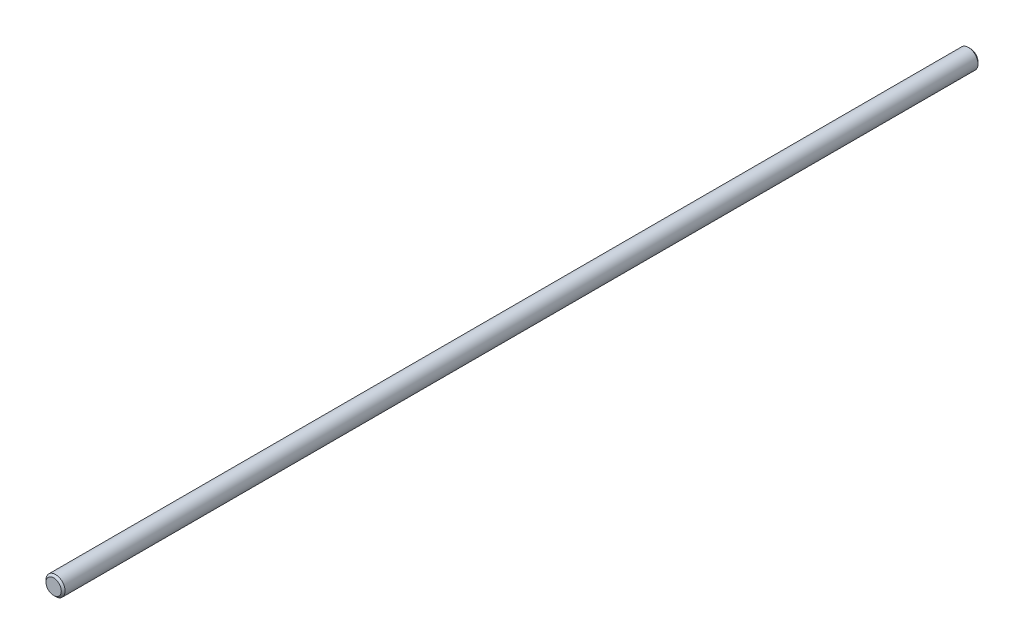
ISO-10303-21;
HEADER;
FILE_DESCRIPTION(('STEP AP214'),'2;1');
FILE_NAME('part.step','',(''),(''),'','','');
FILE_SCHEMA(('AUTOMOTIVE_DESIGN { 1 0 10303 214 1 1 1 1 }'));
ENDSEC;
DATA;
#1=APPLICATION_CONTEXT('core data for automotive mechanical design processes');
#2=APPLICATION_PROTOCOL_DEFINITION('international standard','automotive_design',2000,#1);
#3=PRODUCT_CONTEXT('',#1,'mechanical');
#4=PRODUCT('Part','Part','',(#3));
#5=PRODUCT_RELATED_PRODUCT_CATEGORY('part','',(#4));
#6=PRODUCT_DEFINITION_FORMATION('','',#4);
#7=PRODUCT_DEFINITION_CONTEXT('part definition',#1,'design');
#8=PRODUCT_DEFINITION('design','',#6,#7);
#9=PRODUCT_DEFINITION_SHAPE('','',#8);
#10=(LENGTH_UNIT() NAMED_UNIT(*) SI_UNIT(.MILLI.,.METRE.));
#11=(NAMED_UNIT(*) PLANE_ANGLE_UNIT() SI_UNIT($,.RADIAN.));
#12=(NAMED_UNIT(*) SI_UNIT($,.STERADIAN.) SOLID_ANGLE_UNIT());
#13=UNCERTAINTY_MEASURE_WITH_UNIT(LENGTH_MEASURE(1.E-05),#10,'distance_accuracy_value','');
#14=(GEOMETRIC_REPRESENTATION_CONTEXT(3) GLOBAL_UNCERTAINTY_ASSIGNED_CONTEXT((#13)) GLOBAL_UNIT_ASSIGNED_CONTEXT((#10,
#11,#12)) REPRESENTATION_CONTEXT('',''));
#15=CARTESIAN_POINT('',(0.,0.,0.));
#16=DIRECTION('',(0.,0.,1.));
#17=DIRECTION('',(1.,0.,0.));
#18=AXIS2_PLACEMENT_3D('',#15,#16,#17);
#19=CARTESIAN_POINT('',(0.,0.,114.3));
#20=DIRECTION('',(0.,0.,-1.));
#21=DIRECTION('',(-1.,0.,0.));
#22=AXIS2_PLACEMENT_3D('',#19,#20,#21);
#23=CYLINDRICAL_SURFACE('',#22,2.38125);
#24=CARTESIAN_POINT('',(0.,0.,-113.82375));
#25=DIRECTION('',(0.,0.,1.));
#26=DIRECTION('',(1.,0.,0.));
#27=AXIS2_PLACEMENT_3D('',#24,#25,#26);
#28=CIRCLE('',#27,2.38125);
#29=CARTESIAN_POINT('',(2.38124999999999,0.,-113.82375));
#30=VERTEX_POINT('',#29);
#31=EDGE_CURVE('E41',#30,#30,#28,.T.);
#32=ORIENTED_EDGE('',*,*,#31,.T.);
#33=EDGE_LOOP('',(#32));
#34=FACE_BOUND('',#33,.T.);
#35=CARTESIAN_POINT('',(0.,0.,113.82375));
#36=DIRECTION('',(0.,0.,1.));
#37=DIRECTION('',(1.,0.,0.));
#38=AXIS2_PLACEMENT_3D('',#35,#36,#37);
#39=CIRCLE('',#38,2.38125);
#40=CARTESIAN_POINT('',(2.38125,0.,113.82375));
#41=VERTEX_POINT('',#40);
#42=EDGE_CURVE('E45',#41,#41,#39,.F.);
#43=ORIENTED_EDGE('',*,*,#42,.T.);
#44=EDGE_LOOP('',(#43));
#45=FACE_BOUND('',#44,.T.);
#46=ADVANCED_FACE('F30',(#34,#45),#23,.T.);
#47=CARTESIAN_POINT('',(0.,0.,114.3));
#48=DIRECTION('',(0.,0.,1.));
#49=DIRECTION('',(1.,0.,0.));
#50=AXIS2_PLACEMENT_3D('',#47,#48,#49);
#51=PLANE('',#50);
#52=CARTESIAN_POINT('',(0.,0.,114.3));
#53=DIRECTION('',(0.,0.,1.));
#54=DIRECTION('',(1.,0.,0.));
#55=AXIS2_PLACEMENT_3D('',#52,#53,#54);
#56=CIRCLE('',#55,1.90500000000005);
#57=CARTESIAN_POINT('',(1.90500000000005,0.,114.3));
#58=VERTEX_POINT('',#57);
#59=EDGE_CURVE('E10',#58,#58,#56,.T.);
#60=ORIENTED_EDGE('',*,*,#59,.T.);
#61=EDGE_LOOP('',(#60));
#62=FACE_BOUND('',#61,.T.);
#63=ADVANCED_FACE('F61',(#62),#51,.T.);
#64=CARTESIAN_POINT('',(0.,0.,-114.3));
#65=DIRECTION('',(0.,0.,1.));
#66=DIRECTION('',(1.,0.,0.));
#67=AXIS2_PLACEMENT_3D('',#64,#65,#66);
#68=PLANE('',#67);
#69=CARTESIAN_POINT('',(0.,0.,-114.3));
#70=DIRECTION('',(0.,0.,1.));
#71=DIRECTION('',(1.,0.,0.));
#72=AXIS2_PLACEMENT_3D('',#69,#70,#71);
#73=CIRCLE('',#72,1.90499999999999);
#74=CARTESIAN_POINT('',(1.90499999999998,0.,-114.3));
#75=VERTEX_POINT('',#74);
#76=EDGE_CURVE('E37',#75,#75,#73,.F.);
#77=ORIENTED_EDGE('',*,*,#76,.T.);
#78=EDGE_LOOP('',(#77));
#79=FACE_BOUND('',#78,.T.);
#80=ADVANCED_FACE('F58',(#79),#68,.F.);
#81=CARTESIAN_POINT('',(0.,0.,-113.82375));
#82=DIRECTION('',(0.,0.,1.));
#83=DIRECTION('',(1.,0.,0.));
#84=AXIS2_PLACEMENT_3D('',#81,#82,#83);
#85=CONICAL_SURFACE('',#84,2.38125,0.785398163397447);
#86=CARTESIAN_POINT('',(1.90499999999998,0.,-114.3));
#87=CARTESIAN_POINT('',(1.90996093749999,0.,-114.2950390625));
#88=CARTESIAN_POINT('',(1.91492187499999,0.,-114.290078125));
#89=CARTESIAN_POINT('',(1.92484374999998,0.,-114.28015625));
#90=CARTESIAN_POINT('',(1.92980468749998,0.,-114.2751953125));
#91=CARTESIAN_POINT('',(1.93972656249998,0.,-114.2652734375));
#92=CARTESIAN_POINT('',(1.94468749999998,0.,-114.2603125));
#93=CARTESIAN_POINT('',(1.95460937499999,0.,-114.250390625));
#94=CARTESIAN_POINT('',(1.95957031249999,0.,-114.2454296875));
#95=CARTESIAN_POINT('',(1.96949218749998,0.,-114.2355078125));
#96=CARTESIAN_POINT('',(1.97445312499998,0.,-114.230546875));
#97=CARTESIAN_POINT('',(1.98437499999998,0.,-114.220625));
#98=CARTESIAN_POINT('',(1.98933593749999,0.,-114.2156640625));
#99=CARTESIAN_POINT('',(1.99925781249999,0.,-114.2057421875));
#100=CARTESIAN_POINT('',(2.00421874999999,0.,-114.20078125));
#101=CARTESIAN_POINT('',(2.01414062499998,0.,-114.190859375));
#102=CARTESIAN_POINT('',(2.01910156249998,0.,-114.1858984375));
#103=CARTESIAN_POINT('',(2.02902343749999,0.,-114.1759765625));
#104=CARTESIAN_POINT('',(2.03398437499999,0.,-114.171015625));
#105=CARTESIAN_POINT('',(2.04390624999999,0.,-114.16109375));
#106=CARTESIAN_POINT('',(2.04886718749998,0.,-114.1561328125));
#107=CARTESIAN_POINT('',(2.05878906249998,0.,-114.1462109375));
#108=CARTESIAN_POINT('',(2.06374999999999,0.,-114.14125));
#109=CARTESIAN_POINT('',(2.07367187499999,0.,-114.131328125));
#110=CARTESIAN_POINT('',(2.07863281249999,0.,-114.1263671875));
#111=CARTESIAN_POINT('',(2.08855468749999,0.,-114.1164453125));
#112=CARTESIAN_POINT('',(2.09351562499999,0.,-114.111484375));
#113=CARTESIAN_POINT('',(2.10343749999999,0.,-114.1015625));
#114=CARTESIAN_POINT('',(2.10839843749999,0.,-114.0966015625));
#115=CARTESIAN_POINT('',(2.11832031249999,0.,-114.0866796875));
#116=CARTESIAN_POINT('',(2.12328124999999,0.,-114.08171875));
#117=CARTESIAN_POINT('',(2.13320312499999,0.,-114.071796875));
#118=CARTESIAN_POINT('',(2.13816406249999,0.,-114.0668359375));
#119=CARTESIAN_POINT('',(2.14808593749999,0.,-114.0569140625));
#120=CARTESIAN_POINT('',(2.15304687499999,0.,-114.051953125));
#121=CARTESIAN_POINT('',(2.16296874999999,0.,-114.04203125));
#122=CARTESIAN_POINT('',(2.16792968749999,0.,-114.0370703125));
#123=CARTESIAN_POINT('',(2.17785156249999,0.,-114.0271484375));
#124=CARTESIAN_POINT('',(2.18281249999999,0.,-114.0221875));
#125=CARTESIAN_POINT('',(2.19273437499999,0.,-114.012265625));
#126=CARTESIAN_POINT('',(2.19769531249999,0.,-114.0073046875));
#127=CARTESIAN_POINT('',(2.20761718749999,0.,-113.9973828125));
#128=CARTESIAN_POINT('',(2.21257812499999,0.,-113.992421875));
#129=CARTESIAN_POINT('',(2.22249999999999,0.,-113.9825));
#130=CARTESIAN_POINT('',(2.22746093749999,0.,-113.9775390625));
#131=CARTESIAN_POINT('',(2.23738281249999,0.,-113.9676171875));
#132=CARTESIAN_POINT('',(2.24234374999999,0.,-113.96265625));
#133=CARTESIAN_POINT('',(2.25226562499999,0.,-113.952734375));
#134=CARTESIAN_POINT('',(2.25722656249999,0.,-113.9477734375));
#135=CARTESIAN_POINT('',(2.26714843749999,0.,-113.9378515625));
#136=CARTESIAN_POINT('',(2.27210937499999,0.,-113.932890625));
#137=CARTESIAN_POINT('',(2.28203124999999,0.,-113.92296875));
#138=CARTESIAN_POINT('',(2.28699218749999,0.,-113.9180078125));
#139=CARTESIAN_POINT('',(2.29691406249999,0.,-113.9080859375));
#140=CARTESIAN_POINT('',(2.30187499999999,0.,-113.903125));
#141=CARTESIAN_POINT('',(2.31179687499999,0.,-113.893203125));
#142=CARTESIAN_POINT('',(2.31675781249999,0.,-113.8882421875));
#143=CARTESIAN_POINT('',(2.32667968749999,0.,-113.8783203125));
#144=CARTESIAN_POINT('',(2.33164062499999,0.,-113.873359375));
#145=CARTESIAN_POINT('',(2.34156249999999,0.,-113.8634375));
#146=CARTESIAN_POINT('',(2.34652343749999,0.,-113.8584765625));
#147=CARTESIAN_POINT('',(2.35644531249999,0.,-113.8485546875));
#148=CARTESIAN_POINT('',(2.36140624999999,0.,-113.84359375));
#149=CARTESIAN_POINT('',(2.37132812499999,0.,-113.833671875));
#150=CARTESIAN_POINT('',(2.37628906249999,0.,-113.8287109375));
#151=CARTESIAN_POINT('',(2.38124999999999,0.,-113.82375));
#152=B_SPLINE_CURVE_WITH_KNOTS('',3,(#86,#87,#88,#89,#90,#91,#92,#93,#94,#95,#96,#97,#98,#99,
#100,#101,#102,#103,#104,#105,#106,#107,#108,#109,#110,#111,#112,#113,#114,#115,#116,#117,#118,
#119,#120,#121,#122,#123,#124,#125,#126,#127,#128,#129,#130,#131,#132,#133,#134,#135,#136,#137,
#138,#139,#140,#141,#142,#143,#144,#145,#146,#147,#148,#149,#150,#151),.UNSPECIFIED.,.F.,.F.,(4,
2,2,2,2,2,2,2,2,2,2,2,2,2,2,2,2,2,2,2,2,2,2,2,2,2,2,2,2,2,2,2,4),(0.,0.0210474752837502,
0.0420949505675102,0.0631424258512604,0.0841899011350204,0.10523737641878,0.126284851702531,
0.14733232698629,0.16837980227005,0.189427277553801,0.210474752837561,0.231522228121311,
0.252569703405071,0.273617178688831,0.294664653972581,0.315712129256341,0.336759604540101,
0.357807079823851,0.378854555107611,0.399902030391361,0.420949505675121,0.441996980958881,
0.463044456242631,0.484091931526391,0.505139406810151,0.526186882093901,0.547234357377661,
0.568281832661411,0.589329307945171,0.610376783228931,0.631424258512682,0.652471733796442,
0.673519209080202),.UNSPECIFIED.);
#153=EDGE_CURVE('BSEAM54',#75,#30,#152,.T.);
#154=ORIENTED_EDGE('',*,*,#76,.F.);
#155=ORIENTED_EDGE('',*,*,#31,.F.);
#156=ORIENTED_EDGE('',*,*,#153,.T.);
#157=ORIENTED_EDGE('',*,*,#153,.F.);
#158=EDGE_LOOP('',(#154,#156,#155,#157));
#159=FACE_BOUND('',#158,.T.);
#160=ADVANCED_FACE('F54',(#159),#85,.T.);
#161=CARTESIAN_POINT('',(0.,0.,114.3));
#162=DIRECTION('',(0.,0.,-1.));
#163=DIRECTION('',(-1.,0.,0.));
#164=AXIS2_PLACEMENT_3D('',#161,#162,#163);
#165=CONICAL_SURFACE('',#164,1.90500000000005,0.785398163397432);
#166=ORIENTED_EDGE('',*,*,#42,.F.);
#167=EDGE_LOOP('',(#166));
#168=FACE_BOUND('',#167,.T.);
#169=ORIENTED_EDGE('',*,*,#59,.F.);
#170=EDGE_LOOP('',(#169));
#171=FACE_BOUND('',#170,.T.);
#172=ADVANCED_FACE('F32',(#168,#171),#165,.T.);
#173=CLOSED_SHELL('',(#46,#63,#80,#160,#172));
#174=MANIFOLD_SOLID_BREP('B2',#173);
#175=ADVANCED_BREP_SHAPE_REPRESENTATION('',(#18,#174),#14);
#176=SHAPE_DEFINITION_REPRESENTATION(#9,#175);
ENDSEC;
END-ISO-10303-21;
